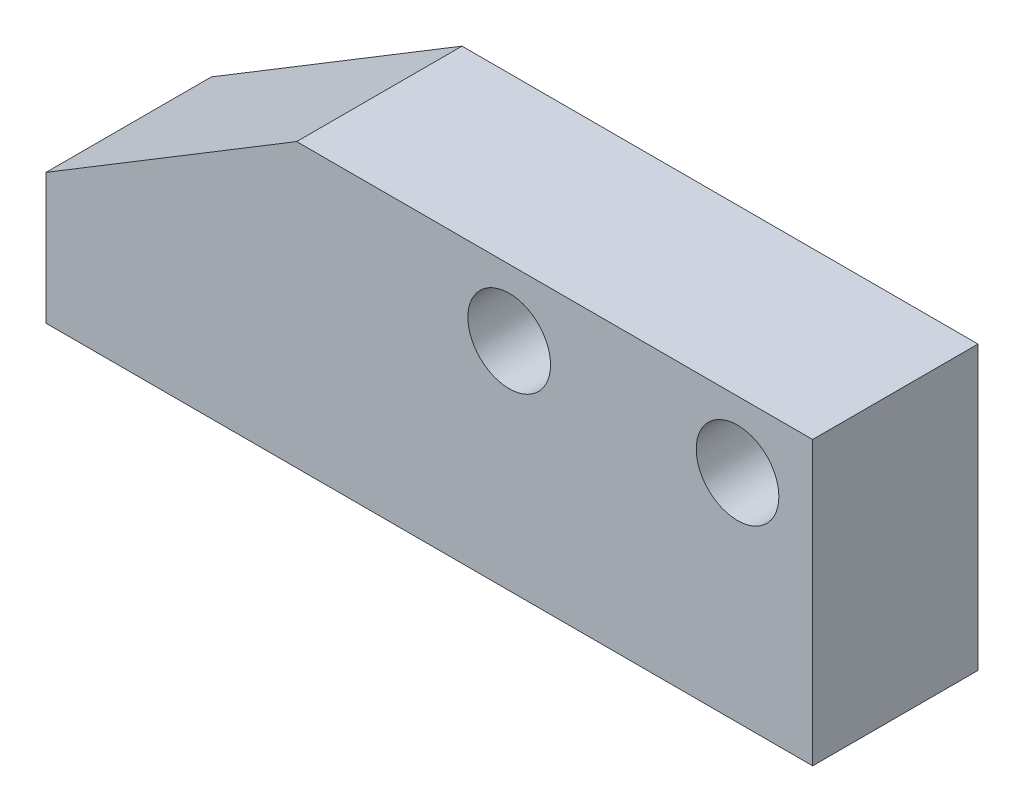
ISO-10303-21;
HEADER;
FILE_DESCRIPTION(('STEP AP214'),'2;1');
FILE_NAME('part.step','',(''),(''),'','','');
FILE_SCHEMA(('AUTOMOTIVE_DESIGN { 1 0 10303 214 1 1 1 1 }'));
ENDSEC;
DATA;
#1=APPLICATION_CONTEXT('core data for automotive mechanical design processes');
#2=APPLICATION_PROTOCOL_DEFINITION('international standard','automotive_design',2000,#1);
#3=PRODUCT_CONTEXT('',#1,'mechanical');
#4=PRODUCT('Part','Part','',(#3));
#5=PRODUCT_RELATED_PRODUCT_CATEGORY('part','',(#4));
#6=PRODUCT_DEFINITION_FORMATION('','',#4);
#7=PRODUCT_DEFINITION_CONTEXT('part definition',#1,'design');
#8=PRODUCT_DEFINITION('design','',#6,#7);
#9=PRODUCT_DEFINITION_SHAPE('','',#8);
#10=(LENGTH_UNIT() NAMED_UNIT(*) SI_UNIT(.MILLI.,.METRE.));
#11=(NAMED_UNIT(*) PLANE_ANGLE_UNIT() SI_UNIT($,.RADIAN.));
#12=(NAMED_UNIT(*) SI_UNIT($,.STERADIAN.) SOLID_ANGLE_UNIT());
#13=UNCERTAINTY_MEASURE_WITH_UNIT(LENGTH_MEASURE(1.E-05),#10,'distance_accuracy_value','');
#14=(GEOMETRIC_REPRESENTATION_CONTEXT(3) GLOBAL_UNCERTAINTY_ASSIGNED_CONTEXT((#13)) GLOBAL_UNIT_ASSIGNED_CONTEXT((#10,
#11,#12)) REPRESENTATION_CONTEXT('',''));
#15=CARTESIAN_POINT('',(0.,0.,0.));
#16=DIRECTION('',(0.,0.,1.));
#17=DIRECTION('',(1.,0.,0.));
#18=AXIS2_PLACEMENT_3D('',#15,#16,#17);
#19=CARTESIAN_POINT('',(0.,0.,60.));
#20=DIRECTION('',(0.,0.,-1.));
#21=DIRECTION('',(-1.,0.,0.));
#22=AXIS2_PLACEMENT_3D('',#19,#20,#21);
#23=PLANE('',#22);
#24=DIRECTION('',(-0.855075624457615,-0.518503304192384,0.));
#25=VECTOR('',#24,1.);
#26=CARTESIAN_POINT('',(-167.41935483871,32.4193548387097,60.));
#27=LINE('',#26,#25);
#28=CARTESIAN_POINT('',(-76.4516129032258,87.5806451612904,60.));
#29=VERTEX_POINT('',#28);
#30=CARTESIAN_POINT('',(-167.41935483871,32.4193548387097,60.));
#31=VERTEX_POINT('',#30);
#32=EDGE_CURVE('E121',#29,#31,#27,.T.);
#33=ORIENTED_EDGE('',*,*,#32,.T.);
#34=DIRECTION('',(0.,-1.,0.));
#35=VECTOR('',#34,1.);
#36=CARTESIAN_POINT('',(-167.41935483871,-15.,60.));
#37=LINE('',#36,#35);
#38=CARTESIAN_POINT('',(-167.41935483871,-15.,60.));
#39=VERTEX_POINT('',#38);
#40=EDGE_CURVE('E88',#31,#39,#37,.T.);
#41=ORIENTED_EDGE('',*,*,#40,.T.);
#42=DIRECTION('',(1.,0.,0.));
#43=VECTOR('',#42,1.);
#44=CARTESIAN_POINT('',(110.806451612903,-15.,60.));
#45=LINE('',#44,#43);
#46=CARTESIAN_POINT('',(110.806451612903,-15.,60.));
#47=VERTEX_POINT('',#46);
#48=EDGE_CURVE('E92',#39,#47,#45,.T.);
#49=ORIENTED_EDGE('',*,*,#48,.T.);
#50=DIRECTION('',(0.,1.,0.));
#51=VECTOR('',#50,1.);
#52=CARTESIAN_POINT('',(110.806451612903,87.5806451612904,60.));
#53=LINE('',#52,#51);
#54=CARTESIAN_POINT('',(110.806451612903,87.5806451612904,60.));
#55=VERTEX_POINT('',#54);
#56=EDGE_CURVE('E96',#47,#55,#53,.T.);
#57=ORIENTED_EDGE('',*,*,#56,.T.);
#58=DIRECTION('',(-1.,0.,0.));
#59=VECTOR('',#58,1.);
#60=CARTESIAN_POINT('',(-76.4516129032258,87.5806451612904,60.));
#61=LINE('',#60,#59);
#62=EDGE_CURVE('E54',#55,#29,#61,.T.);
#63=ORIENTED_EDGE('',*,*,#62,.T.);
#64=EDGE_LOOP('',(#33,#41,#49,#57,#63));
#65=FACE_BOUND('',#64,.T.);
#66=CARTESIAN_POINT('',(83.5386946537394,63.4744578942581,60.));
#67=DIRECTION('',(0.,0.,1.));
#68=DIRECTION('',(1.,0.,0.));
#69=AXIS2_PLACEMENT_3D('',#66,#67,#68);
#70=CIRCLE('',#69,15.);
#71=CARTESIAN_POINT('',(98.5386946537394,63.4744578942581,60.));
#72=VERTEX_POINT('',#71);
#73=EDGE_CURVE('E116',#72,#72,#70,.T.);
#74=ORIENTED_EDGE('',*,*,#73,.F.);
#75=EDGE_LOOP('',(#74));
#76=FACE_BOUND('',#75,.T.);
#77=CARTESIAN_POINT('',(0.674711508928956,63.4744578942581,60.));
#78=DIRECTION('',(0.,0.,1.));
#79=DIRECTION('',(1.,0.,0.));
#80=AXIS2_PLACEMENT_3D('',#77,#78,#79);
#81=CIRCLE('',#80,15.);
#82=CARTESIAN_POINT('',(15.674711508929,63.4744578942581,60.));
#83=VERTEX_POINT('',#82);
#84=EDGE_CURVE('E157',#83,#83,#81,.T.);
#85=ORIENTED_EDGE('',*,*,#84,.F.);
#86=EDGE_LOOP('',(#85));
#87=FACE_BOUND('',#86,.T.);
#88=ADVANCED_FACE('F37',(#65,#76,#87),#23,.F.);
#89=CARTESIAN_POINT('',(0.,0.,0.));
#90=DIRECTION('',(0.,0.,-1.));
#91=DIRECTION('',(-1.,0.,0.));
#92=AXIS2_PLACEMENT_3D('',#89,#90,#91);
#93=PLANE('',#92);
#94=CARTESIAN_POINT('',(83.5386946537394,63.4744578942581,0.));
#95=DIRECTION('',(0.,0.,1.));
#96=DIRECTION('',(1.,0.,0.));
#97=AXIS2_PLACEMENT_3D('',#94,#95,#96);
#98=CIRCLE('',#97,15.);
#99=CARTESIAN_POINT('',(98.5386946537394,63.4744578942581,0.));
#100=VERTEX_POINT('',#99);
#101=EDGE_CURVE('E162',#100,#100,#98,.T.);
#102=ORIENTED_EDGE('',*,*,#101,.T.);
#103=EDGE_LOOP('',(#102));
#104=FACE_BOUND('',#103,.T.);
#105=DIRECTION('',(-0.855075624457615,-0.518503304192384,0.));
#106=VECTOR('',#105,1.);
#107=CARTESIAN_POINT('',(-167.41935483871,32.4193548387097,0.));
#108=LINE('',#107,#106);
#109=CARTESIAN_POINT('',(-76.4516129032258,87.5806451612904,0.));
#110=VERTEX_POINT('',#109);
#111=CARTESIAN_POINT('',(-167.41935483871,32.4193548387097,0.));
#112=VERTEX_POINT('',#111);
#113=EDGE_CURVE('E112',#110,#112,#108,.T.);
#114=ORIENTED_EDGE('',*,*,#113,.F.);
#115=DIRECTION('',(-1.,0.,0.));
#116=VECTOR('',#115,1.);
#117=CARTESIAN_POINT('',(-76.4516129032258,87.5806451612904,0.));
#118=LINE('',#117,#116);
#119=CARTESIAN_POINT('',(110.806451612903,87.5806451612904,0.));
#120=VERTEX_POINT('',#119);
#121=EDGE_CURVE('E80',#120,#110,#118,.T.);
#122=ORIENTED_EDGE('',*,*,#121,.F.);
#123=DIRECTION('',(0.,1.,0.));
#124=VECTOR('',#123,1.);
#125=CARTESIAN_POINT('',(110.806451612903,87.5806451612904,0.));
#126=LINE('',#125,#124);
#127=CARTESIAN_POINT('',(110.806451612903,-15.,0.));
#128=VERTEX_POINT('',#127);
#129=EDGE_CURVE('E74',#128,#120,#126,.T.);
#130=ORIENTED_EDGE('',*,*,#129,.F.);
#131=DIRECTION('',(1.,0.,0.));
#132=VECTOR('',#131,1.);
#133=CARTESIAN_POINT('',(110.806451612903,-15.,0.));
#134=LINE('',#133,#132);
#135=CARTESIAN_POINT('',(-167.41935483871,-15.,0.));
#136=VERTEX_POINT('',#135);
#137=EDGE_CURVE('E103',#136,#128,#134,.T.);
#138=ORIENTED_EDGE('',*,*,#137,.F.);
#139=DIRECTION('',(0.,-1.,0.));
#140=VECTOR('',#139,1.);
#141=CARTESIAN_POINT('',(-167.41935483871,-15.,0.));
#142=LINE('',#141,#140);
#143=EDGE_CURVE('E115',#112,#136,#142,.T.);
#144=ORIENTED_EDGE('',*,*,#143,.F.);
#145=EDGE_LOOP('',(#114,#122,#130,#138,#144));
#146=FACE_BOUND('',#145,.T.);
#147=CARTESIAN_POINT('',(0.674711508928956,63.4744578942581,0.));
#148=DIRECTION('',(0.,0.,1.));
#149=DIRECTION('',(1.,0.,0.));
#150=AXIS2_PLACEMENT_3D('',#147,#148,#149);
#151=CIRCLE('',#150,15.);
#152=CARTESIAN_POINT('',(15.674711508929,63.4744578942581,0.));
#153=VERTEX_POINT('',#152);
#154=EDGE_CURVE('E160',#153,#153,#151,.T.);
#155=ORIENTED_EDGE('',*,*,#154,.T.);
#156=EDGE_LOOP('',(#155));
#157=FACE_BOUND('',#156,.T.);
#158=ADVANCED_FACE('F125',(#104,#146,#157),#93,.T.);
#159=CARTESIAN_POINT('',(-167.41935483871,32.4193548387097,60.));
#160=DIRECTION('',(0.518503304192384,-0.855075624457615,0.));
#161=DIRECTION('',(0.855075624457615,0.518503304192384,0.));
#162=AXIS2_PLACEMENT_3D('',#159,#160,#161);
#163=PLANE('',#162);
#164=ORIENTED_EDGE('',*,*,#113,.T.);
#165=DIRECTION('',(0.,0.,-1.));
#166=VECTOR('',#165,1.);
#167=CARTESIAN_POINT('',(-167.41935483871,32.4193548387097,60.));
#168=LINE('',#167,#166);
#169=EDGE_CURVE('E11',#31,#112,#168,.T.);
#170=ORIENTED_EDGE('',*,*,#169,.F.);
#171=ORIENTED_EDGE('',*,*,#32,.F.);
#172=DIRECTION('',(0.,0.,-1.));
#173=VECTOR('',#172,1.);
#174=CARTESIAN_POINT('',(-76.4516129032258,87.5806451612904,60.));
#175=LINE('',#174,#173);
#176=EDGE_CURVE('E108',#29,#110,#175,.T.);
#177=ORIENTED_EDGE('',*,*,#176,.T.);
#178=EDGE_LOOP('',(#164,#170,#171,#177));
#179=FACE_BOUND('',#178,.T.);
#180=ADVANCED_FACE('F39',(#179),#163,.F.);
#181=CARTESIAN_POINT('',(-167.41935483871,-15.,60.));
#182=DIRECTION('',(1.,0.,0.));
#183=DIRECTION('',(0.,0.,-1.));
#184=AXIS2_PLACEMENT_3D('',#181,#182,#183);
#185=PLANE('',#184);
#186=ORIENTED_EDGE('',*,*,#143,.T.);
#187=DIRECTION('',(0.,0.,-1.));
#188=VECTOR('',#187,1.);
#189=CARTESIAN_POINT('',(-167.41935483871,-15.,60.));
#190=LINE('',#189,#188);
#191=EDGE_CURVE('E46',#39,#136,#190,.T.);
#192=ORIENTED_EDGE('',*,*,#191,.F.);
#193=ORIENTED_EDGE('',*,*,#40,.F.);
#194=ORIENTED_EDGE('',*,*,#169,.T.);
#195=EDGE_LOOP('',(#186,#192,#193,#194));
#196=FACE_BOUND('',#195,.T.);
#197=ADVANCED_FACE('F199',(#196),#185,.F.);
#198=CARTESIAN_POINT('',(110.806451612903,-15.,60.));
#199=DIRECTION('',(0.,1.,0.));
#200=DIRECTION('',(0.,0.,1.));
#201=AXIS2_PLACEMENT_3D('',#198,#199,#200);
#202=PLANE('',#201);
#203=ORIENTED_EDGE('',*,*,#137,.T.);
#204=DIRECTION('',(0.,0.,-1.));
#205=VECTOR('',#204,1.);
#206=CARTESIAN_POINT('',(110.806451612903,-15.,60.));
#207=LINE('',#206,#205);
#208=EDGE_CURVE('E100',#47,#128,#207,.T.);
#209=ORIENTED_EDGE('',*,*,#208,.F.);
#210=ORIENTED_EDGE('',*,*,#48,.F.);
#211=ORIENTED_EDGE('',*,*,#191,.T.);
#212=EDGE_LOOP('',(#203,#209,#210,#211));
#213=FACE_BOUND('',#212,.T.);
#214=ADVANCED_FACE('F101',(#213),#202,.F.);
#215=CARTESIAN_POINT('',(110.806451612903,87.5806451612904,60.));
#216=DIRECTION('',(-1.,0.,0.));
#217=DIRECTION('',(0.,0.,1.));
#218=AXIS2_PLACEMENT_3D('',#215,#216,#217);
#219=PLANE('',#218);
#220=ORIENTED_EDGE('',*,*,#129,.T.);
#221=DIRECTION('',(0.,0.,-1.));
#222=VECTOR('',#221,1.);
#223=CARTESIAN_POINT('',(110.806451612903,87.5806451612904,60.));
#224=LINE('',#223,#222);
#225=EDGE_CURVE('E104',#55,#120,#224,.T.);
#226=ORIENTED_EDGE('',*,*,#225,.F.);
#227=ORIENTED_EDGE('',*,*,#56,.F.);
#228=ORIENTED_EDGE('',*,*,#208,.T.);
#229=EDGE_LOOP('',(#220,#226,#227,#228));
#230=FACE_BOUND('',#229,.T.);
#231=ADVANCED_FACE('F106',(#230),#219,.F.);
#232=CARTESIAN_POINT('',(-76.4516129032258,87.5806451612904,60.));
#233=DIRECTION('',(0.,-1.,0.));
#234=DIRECTION('',(0.,0.,-1.));
#235=AXIS2_PLACEMENT_3D('',#232,#233,#234);
#236=PLANE('',#235);
#237=ORIENTED_EDGE('',*,*,#121,.T.);
#238=ORIENTED_EDGE('',*,*,#176,.F.);
#239=ORIENTED_EDGE('',*,*,#62,.F.);
#240=ORIENTED_EDGE('',*,*,#225,.T.);
#241=EDGE_LOOP('',(#237,#238,#239,#240));
#242=FACE_BOUND('',#241,.T.);
#243=ADVANCED_FACE('F130',(#242),#236,.F.);
#244=CARTESIAN_POINT('',(83.5386946537394,63.4744578942581,60.));
#245=DIRECTION('',(0.,0.,-1.));
#246=DIRECTION('',(-1.,0.,0.));
#247=AXIS2_PLACEMENT_3D('',#244,#245,#246);
#248=CYLINDRICAL_SURFACE('',#247,15.);
#249=ORIENTED_EDGE('',*,*,#73,.T.);
#250=EDGE_LOOP('',(#249));
#251=FACE_BOUND('',#250,.T.);
#252=ORIENTED_EDGE('',*,*,#101,.F.);
#253=EDGE_LOOP('',(#252));
#254=FACE_BOUND('',#253,.T.);
#255=ADVANCED_FACE('F132',(#251,#254),#248,.F.);
#256=CARTESIAN_POINT('',(0.674711508928956,63.4744578942581,60.));
#257=DIRECTION('',(0.,0.,-1.));
#258=DIRECTION('',(-1.,0.,0.));
#259=AXIS2_PLACEMENT_3D('',#256,#257,#258);
#260=CYLINDRICAL_SURFACE('',#259,15.);
#261=ORIENTED_EDGE('',*,*,#84,.T.);
#262=EDGE_LOOP('',(#261));
#263=FACE_BOUND('',#262,.T.);
#264=ORIENTED_EDGE('',*,*,#154,.F.);
#265=EDGE_LOOP('',(#264));
#266=FACE_BOUND('',#265,.T.);
#267=ADVANCED_FACE('F138',(#263,#266),#260,.F.);
#268=CLOSED_SHELL('',(#88,#158,#180,#197,#214,#231,#243,#255,#267));
#269=MANIFOLD_SOLID_BREP('B2',#268);
#270=ADVANCED_BREP_SHAPE_REPRESENTATION('',(#18,#269),#14);
#271=SHAPE_DEFINITION_REPRESENTATION(#9,#270);
ENDSEC;
END-ISO-10303-21;
